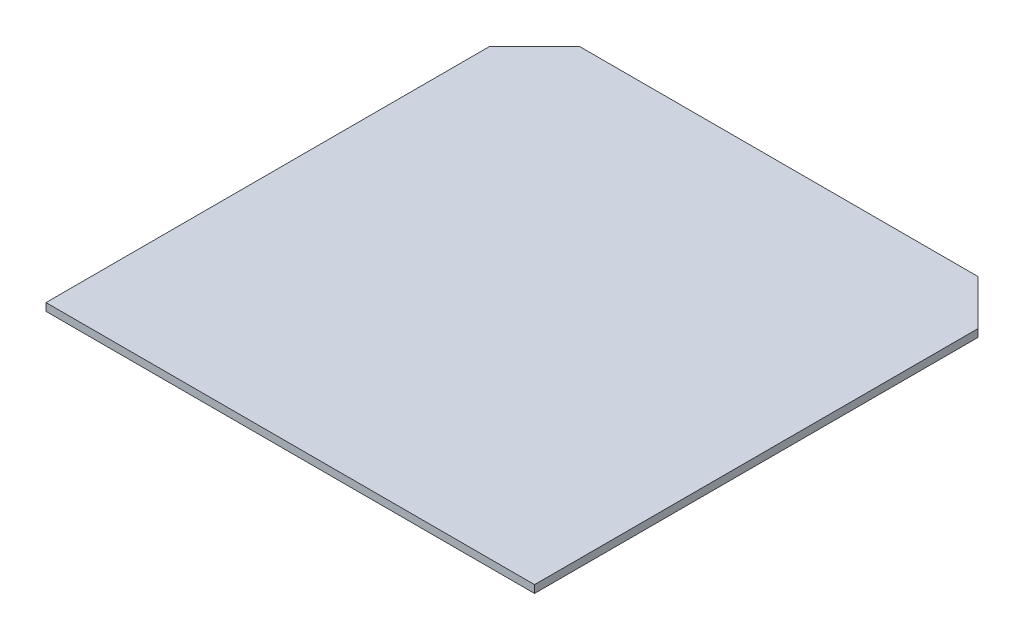
ISO-10303-21;
HEADER;
FILE_DESCRIPTION(('STEP AP214'),'2;1');
FILE_NAME('part.step','',(''),(''),'','','');
FILE_SCHEMA(('AUTOMOTIVE_DESIGN { 1 0 10303 214 1 1 1 1 }'));
ENDSEC;
DATA;
#1=APPLICATION_CONTEXT('core data for automotive mechanical design processes');
#2=APPLICATION_PROTOCOL_DEFINITION('international standard','automotive_design',2000,#1);
#3=PRODUCT_CONTEXT('',#1,'mechanical');
#4=PRODUCT('Part','Part','',(#3));
#5=PRODUCT_RELATED_PRODUCT_CATEGORY('part','',(#4));
#6=PRODUCT_DEFINITION_FORMATION('','',#4);
#7=PRODUCT_DEFINITION_CONTEXT('part definition',#1,'design');
#8=PRODUCT_DEFINITION('design','',#6,#7);
#9=PRODUCT_DEFINITION_SHAPE('','',#8);
#10=(LENGTH_UNIT() NAMED_UNIT(*) SI_UNIT(.MILLI.,.METRE.));
#11=(NAMED_UNIT(*) PLANE_ANGLE_UNIT() SI_UNIT($,.RADIAN.));
#12=(NAMED_UNIT(*) SI_UNIT($,.STERADIAN.) SOLID_ANGLE_UNIT());
#13=UNCERTAINTY_MEASURE_WITH_UNIT(LENGTH_MEASURE(1.E-05),#10,'distance_accuracy_value','');
#14=(GEOMETRIC_REPRESENTATION_CONTEXT(3) GLOBAL_UNCERTAINTY_ASSIGNED_CONTEXT((#13)) GLOBAL_UNIT_ASSIGNED_CONTEXT((#10,
#11,#12)) REPRESENTATION_CONTEXT('',''));
#15=CARTESIAN_POINT('',(0.,0.,0.));
#16=DIRECTION('',(0.,0.,1.));
#17=DIRECTION('',(1.,0.,0.));
#18=AXIS2_PLACEMENT_3D('',#15,#16,#17);
#19=CARTESIAN_POINT('',(32.5,1.02,-26.5));
#20=DIRECTION('',(-0.707106781186548,0.,0.707106781186547));
#21=DIRECTION('',(0.,1.,0.));
#22=AXIS2_PLACEMENT_3D('',#19,#20,#21);
#23=PLANE('',#22);
#24=DIRECTION('',(0.,1.,0.));
#25=VECTOR('',#24,1.);
#26=CARTESIAN_POINT('',(32.5,1.02,-26.5));
#27=LINE('',#26,#25);
#28=CARTESIAN_POINT('',(32.5,0.,-26.5));
#29=VERTEX_POINT('',#28);
#30=CARTESIAN_POINT('',(32.5,1.02,-26.5));
#31=VERTEX_POINT('',#30);
#32=EDGE_CURVE('E140',#29,#31,#27,.T.);
#33=ORIENTED_EDGE('',*,*,#32,.F.);
#34=DIRECTION('',(-0.707106781186547,0.,-0.707106781186548));
#35=VECTOR('',#34,1.);
#36=CARTESIAN_POINT('',(29.5,0.,-29.5));
#37=LINE('',#36,#35);
#38=CARTESIAN_POINT('',(26.5,0.,-32.5));
#39=VERTEX_POINT('',#38);
#40=EDGE_CURVE('E53',#39,#29,#37,.F.);
#41=ORIENTED_EDGE('',*,*,#40,.F.);
#42=DIRECTION('',(0.,-1.,0.));
#43=VECTOR('',#42,1.);
#44=CARTESIAN_POINT('',(26.5,1.02,-32.5));
#45=LINE('',#44,#43);
#46=CARTESIAN_POINT('',(26.5,1.02,-32.5));
#47=VERTEX_POINT('',#46);
#48=EDGE_CURVE('E143',#47,#39,#45,.T.);
#49=ORIENTED_EDGE('',*,*,#48,.F.);
#50=DIRECTION('',(0.707106781186547,0.,0.707106781186548));
#51=VECTOR('',#50,1.);
#52=CARTESIAN_POINT('',(32.5,1.02,-26.5));
#53=LINE('',#52,#51);
#54=EDGE_CURVE('E13',#31,#47,#53,.F.);
#55=ORIENTED_EDGE('',*,*,#54,.F.);
#56=EDGE_LOOP('',(#33,#41,#49,#55));
#57=FACE_BOUND('',#56,.T.);
#58=ADVANCED_FACE('F45',(#57),#23,.F.);
#59=CARTESIAN_POINT('',(-26.5,1.02,-32.5));
#60=DIRECTION('',(0.707106781186548,0.,0.707106781186548));
#61=DIRECTION('',(0.,1.,0.));
#62=AXIS2_PLACEMENT_3D('',#59,#60,#61);
#63=PLANE('',#62);
#64=DIRECTION('',(0.,1.,0.));
#65=VECTOR('',#64,1.);
#66=CARTESIAN_POINT('',(-26.5,1.02,-32.5));
#67=LINE('',#66,#65);
#68=CARTESIAN_POINT('',(-26.5,0.,-32.5));
#69=VERTEX_POINT('',#68);
#70=CARTESIAN_POINT('',(-26.5,1.02,-32.5));
#71=VERTEX_POINT('',#70);
#72=EDGE_CURVE('E113',#69,#71,#67,.T.);
#73=ORIENTED_EDGE('',*,*,#72,.F.);
#74=DIRECTION('',(-0.707106781186548,0.,0.707106781186548));
#75=VECTOR('',#74,1.);
#76=CARTESIAN_POINT('',(-29.5,0.,-29.5));
#77=LINE('',#76,#75);
#78=CARTESIAN_POINT('',(-32.5,0.,-26.5));
#79=VERTEX_POINT('',#78);
#80=EDGE_CURVE('E136',#79,#69,#77,.F.);
#81=ORIENTED_EDGE('',*,*,#80,.F.);
#82=DIRECTION('',(0.,-1.,0.));
#83=VECTOR('',#82,1.);
#84=CARTESIAN_POINT('',(-32.5,1.02,-26.5));
#85=LINE('',#84,#83);
#86=CARTESIAN_POINT('',(-32.5,1.02,-26.5));
#87=VERTEX_POINT('',#86);
#88=EDGE_CURVE('E134',#87,#79,#85,.T.);
#89=ORIENTED_EDGE('',*,*,#88,.F.);
#90=DIRECTION('',(0.707106781186548,0.,-0.707106781186548));
#91=VECTOR('',#90,1.);
#92=CARTESIAN_POINT('',(-26.5,1.02,-32.5));
#93=LINE('',#92,#91);
#94=EDGE_CURVE('E100',#71,#87,#93,.F.);
#95=ORIENTED_EDGE('',*,*,#94,.F.);
#96=EDGE_LOOP('',(#73,#81,#89,#95));
#97=FACE_BOUND('',#96,.T.);
#98=ADVANCED_FACE('F155',(#97),#63,.F.);
#99=CARTESIAN_POINT('',(32.5,1.02,32.5));
#100=DIRECTION('',(-1.,0.,0.));
#101=DIRECTION('',(0.,0.,1.));
#102=AXIS2_PLACEMENT_3D('',#99,#100,#101);
#103=PLANE('',#102);
#104=DIRECTION('',(0.,0.,-1.));
#105=VECTOR('',#104,1.);
#106=CARTESIAN_POINT('',(32.5,0.,32.5));
#107=LINE('',#106,#105);
#108=CARTESIAN_POINT('',(32.5,0.,32.5));
#109=VERTEX_POINT('',#108);
#110=EDGE_CURVE('E123',#109,#29,#107,.T.);
#111=ORIENTED_EDGE('',*,*,#110,.T.);
#112=ORIENTED_EDGE('',*,*,#32,.T.);
#113=DIRECTION('',(0.,0.,-1.));
#114=VECTOR('',#113,1.);
#115=CARTESIAN_POINT('',(32.5,1.02,32.5));
#116=LINE('',#115,#114);
#117=CARTESIAN_POINT('',(32.5,1.02,32.5));
#118=VERTEX_POINT('',#117);
#119=EDGE_CURVE('E130',#118,#31,#116,.T.);
#120=ORIENTED_EDGE('',*,*,#119,.F.);
#121=DIRECTION('',(0.,-1.,0.));
#122=VECTOR('',#121,1.);
#123=CARTESIAN_POINT('',(32.5,1.02,32.5));
#124=LINE('',#123,#122);
#125=EDGE_CURVE('E114',#118,#109,#124,.T.);
#126=ORIENTED_EDGE('',*,*,#125,.T.);
#127=EDGE_LOOP('',(#111,#112,#120,#126));
#128=FACE_BOUND('',#127,.T.);
#129=ADVANCED_FACE('F149',(#128),#103,.F.);
#130=CARTESIAN_POINT('',(-32.5,1.02,-32.5));
#131=DIRECTION('',(0.,0.,1.));
#132=DIRECTION('',(1.,0.,0.));
#133=AXIS2_PLACEMENT_3D('',#130,#131,#132);
#134=PLANE('',#133);
#135=DIRECTION('',(-1.,0.,0.));
#136=VECTOR('',#135,1.);
#137=CARTESIAN_POINT('',(-32.5,1.02,-32.5));
#138=LINE('',#137,#136);
#139=EDGE_CURVE('E104',#47,#71,#138,.T.);
#140=ORIENTED_EDGE('',*,*,#139,.F.);
#141=ORIENTED_EDGE('',*,*,#48,.T.);
#142=DIRECTION('',(-1.,0.,0.));
#143=VECTOR('',#142,1.);
#144=CARTESIAN_POINT('',(-32.5,0.,-32.5));
#145=LINE('',#144,#143);
#146=EDGE_CURVE('E126',#39,#69,#145,.T.);
#147=ORIENTED_EDGE('',*,*,#146,.T.);
#148=ORIENTED_EDGE('',*,*,#72,.T.);
#149=EDGE_LOOP('',(#140,#141,#147,#148));
#150=FACE_BOUND('',#149,.T.);
#151=ADVANCED_FACE('F156',(#150),#134,.F.);
#152=CARTESIAN_POINT('',(-32.5,1.02,32.5));
#153=DIRECTION('',(1.,0.,0.));
#154=DIRECTION('',(0.,0.,-1.));
#155=AXIS2_PLACEMENT_3D('',#152,#153,#154);
#156=PLANE('',#155);
#157=DIRECTION('',(0.,0.,1.));
#158=VECTOR('',#157,1.);
#159=CARTESIAN_POINT('',(-32.5,1.02,32.5));
#160=LINE('',#159,#158);
#161=CARTESIAN_POINT('',(-32.5,1.02,32.5));
#162=VERTEX_POINT('',#161);
#163=EDGE_CURVE('E93',#87,#162,#160,.T.);
#164=ORIENTED_EDGE('',*,*,#163,.F.);
#165=ORIENTED_EDGE('',*,*,#88,.T.);
#166=DIRECTION('',(0.,0.,1.));
#167=VECTOR('',#166,1.);
#168=CARTESIAN_POINT('',(-32.5,0.,32.5));
#169=LINE('',#168,#167);
#170=CARTESIAN_POINT('',(-32.5,0.,32.5));
#171=VERTEX_POINT('',#170);
#172=EDGE_CURVE('E110',#79,#171,#169,.T.);
#173=ORIENTED_EDGE('',*,*,#172,.T.);
#174=DIRECTION('',(0.,-1.,0.));
#175=VECTOR('',#174,1.);
#176=CARTESIAN_POINT('',(-32.5,1.02,32.5));
#177=LINE('',#176,#175);
#178=EDGE_CURVE('E107',#162,#171,#177,.T.);
#179=ORIENTED_EDGE('',*,*,#178,.F.);
#180=EDGE_LOOP('',(#164,#165,#173,#179));
#181=FACE_BOUND('',#180,.T.);
#182=ADVANCED_FACE('F108',(#181),#156,.F.);
#183=CARTESIAN_POINT('',(-32.5,1.02,32.5));
#184=DIRECTION('',(0.,0.,-1.));
#185=DIRECTION('',(-1.,0.,0.));
#186=AXIS2_PLACEMENT_3D('',#183,#184,#185);
#187=PLANE('',#186);
#188=DIRECTION('',(1.,0.,0.));
#189=VECTOR('',#188,1.);
#190=CARTESIAN_POINT('',(-32.5,0.,32.5));
#191=LINE('',#190,#189);
#192=EDGE_CURVE('E129',#171,#109,#191,.T.);
#193=ORIENTED_EDGE('',*,*,#192,.T.);
#194=ORIENTED_EDGE('',*,*,#125,.F.);
#195=DIRECTION('',(1.,0.,0.));
#196=VECTOR('',#195,1.);
#197=CARTESIAN_POINT('',(-32.5,1.02,32.5));
#198=LINE('',#197,#196);
#199=EDGE_CURVE('E97',#162,#118,#198,.T.);
#200=ORIENTED_EDGE('',*,*,#199,.F.);
#201=ORIENTED_EDGE('',*,*,#178,.T.);
#202=EDGE_LOOP('',(#193,#194,#200,#201));
#203=FACE_BOUND('',#202,.T.);
#204=ADVANCED_FACE('F116',(#203),#187,.F.);
#205=CARTESIAN_POINT('',(0.,1.02,0.));
#206=DIRECTION('',(0.,-1.,0.));
#207=DIRECTION('',(0.,0.,-1.));
#208=AXIS2_PLACEMENT_3D('',#205,#206,#207);
#209=PLANE('',#208);
#210=ORIENTED_EDGE('',*,*,#119,.T.);
#211=ORIENTED_EDGE('',*,*,#54,.T.);
#212=ORIENTED_EDGE('',*,*,#139,.T.);
#213=ORIENTED_EDGE('',*,*,#94,.T.);
#214=ORIENTED_EDGE('',*,*,#163,.T.);
#215=ORIENTED_EDGE('',*,*,#199,.T.);
#216=EDGE_LOOP('',(#210,#211,#212,#213,#214,#215));
#217=FACE_BOUND('',#216,.T.);
#218=ADVANCED_FACE('F95',(#217),#209,.F.);
#219=CARTESIAN_POINT('',(0.,0.,0.));
#220=DIRECTION('',(0.,-1.,0.));
#221=DIRECTION('',(0.,0.,-1.));
#222=AXIS2_PLACEMENT_3D('',#219,#220,#221);
#223=PLANE('',#222);
#224=ORIENTED_EDGE('',*,*,#146,.F.);
#225=ORIENTED_EDGE('',*,*,#40,.T.);
#226=ORIENTED_EDGE('',*,*,#110,.F.);
#227=ORIENTED_EDGE('',*,*,#192,.F.);
#228=ORIENTED_EDGE('',*,*,#172,.F.);
#229=ORIENTED_EDGE('',*,*,#80,.T.);
#230=EDGE_LOOP('',(#224,#225,#226,#227,#228,#229));
#231=FACE_BOUND('',#230,.T.);
#232=ADVANCED_FACE('F147',(#231),#223,.T.);
#233=CLOSED_SHELL('',(#58,#98,#129,#151,#182,#204,#218,#232));
#234=MANIFOLD_SOLID_BREP('B2',#233);
#235=ADVANCED_BREP_SHAPE_REPRESENTATION('',(#18,#234),#14);
#236=SHAPE_DEFINITION_REPRESENTATION(#9,#235);
ENDSEC;
END-ISO-10303-21;
